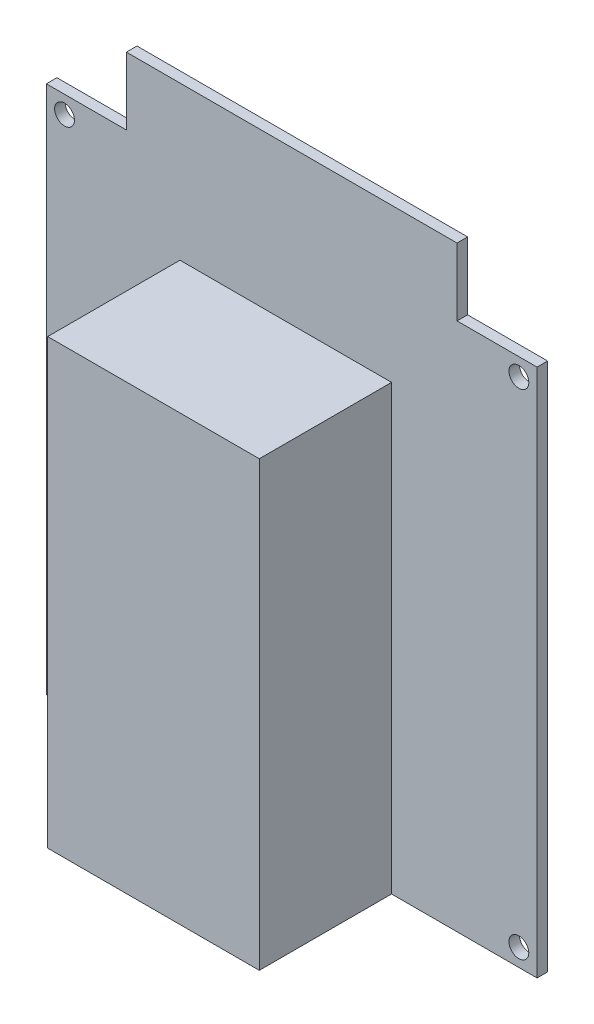
ISO-10303-21;
HEADER;
FILE_DESCRIPTION(('STEP AP214'),'2;1');
FILE_NAME('part.step','',(''),(''),'','','');
FILE_SCHEMA(('AUTOMOTIVE_DESIGN { 1 0 10303 214 1 1 1 1 }'));
ENDSEC;
DATA;
#1=APPLICATION_CONTEXT('core data for automotive mechanical design processes');
#2=APPLICATION_PROTOCOL_DEFINITION('international standard','automotive_design',2000,#1);
#3=PRODUCT_CONTEXT('',#1,'mechanical');
#4=PRODUCT('Part','Part','',(#3));
#5=PRODUCT_RELATED_PRODUCT_CATEGORY('part','',(#4));
#6=PRODUCT_DEFINITION_FORMATION('','',#4);
#7=PRODUCT_DEFINITION_CONTEXT('part definition',#1,'design');
#8=PRODUCT_DEFINITION('design','',#6,#7);
#9=PRODUCT_DEFINITION_SHAPE('','',#8);
#10=(LENGTH_UNIT() NAMED_UNIT(*) SI_UNIT(.MILLI.,.METRE.));
#11=(NAMED_UNIT(*) PLANE_ANGLE_UNIT() SI_UNIT($,.RADIAN.));
#12=(NAMED_UNIT(*) SI_UNIT($,.STERADIAN.) SOLID_ANGLE_UNIT());
#13=UNCERTAINTY_MEASURE_WITH_UNIT(LENGTH_MEASURE(1.E-05),#10,'distance_accuracy_value','');
#14=(GEOMETRIC_REPRESENTATION_CONTEXT(3) GLOBAL_UNCERTAINTY_ASSIGNED_CONTEXT((#13)) GLOBAL_UNIT_ASSIGNED_CONTEXT((#10,
#11,#12)) REPRESENTATION_CONTEXT('',''));
#15=CARTESIAN_POINT('',(0.,0.,0.));
#16=DIRECTION('',(0.,0.,1.));
#17=DIRECTION('',(1.,0.,0.));
#18=AXIS2_PLACEMENT_3D('',#15,#16,#17);
#19=CARTESIAN_POINT('',(20.2,67.,1.6));
#20=DIRECTION('',(0.,1.,0.));
#21=DIRECTION('',(0.,0.,1.));
#22=AXIS2_PLACEMENT_3D('',#19,#20,#21);
#23=PLANE('',#22);
#24=DIRECTION('',(1.,0.,0.));
#25=VECTOR('',#24,1.);
#26=CARTESIAN_POINT('',(37.1,67.,1.6));
#27=LINE('',#26,#25);
#28=CARTESIAN_POINT('',(20.2,67.,1.6));
#29=VERTEX_POINT('',#28);
#30=CARTESIAN_POINT('',(52.2,67.,1.6));
#31=VERTEX_POINT('',#30);
#32=EDGE_CURVE('E198',#29,#31,#27,.T.);
#33=ORIENTED_EDGE('',*,*,#32,.F.);
#34=DIRECTION('',(0.,0.,1.));
#35=VECTOR('',#34,1.);
#36=CARTESIAN_POINT('',(20.2,67.,1.6));
#37=LINE('',#36,#35);
#38=CARTESIAN_POINT('',(20.2,67.,21.6));
#39=VERTEX_POINT('',#38);
#40=EDGE_CURVE('E124',#39,#29,#37,.F.);
#41=ORIENTED_EDGE('',*,*,#40,.F.);
#42=DIRECTION('',(1.,0.,0.));
#43=VECTOR('',#42,1.);
#44=CARTESIAN_POINT('',(36.2,67.,21.6));
#45=LINE('',#44,#43);
#46=CARTESIAN_POINT('',(52.2,67.,21.6));
#47=VERTEX_POINT('',#46);
#48=EDGE_CURVE('E104',#47,#39,#45,.F.);
#49=ORIENTED_EDGE('',*,*,#48,.F.);
#50=DIRECTION('',(0.,0.,-1.));
#51=VECTOR('',#50,1.);
#52=CARTESIAN_POINT('',(52.2,67.,1.6));
#53=LINE('',#52,#51);
#54=EDGE_CURVE('E111',#31,#47,#53,.F.);
#55=ORIENTED_EDGE('',*,*,#54,.F.);
#56=EDGE_LOOP('',(#33,#41,#49,#55));
#57=FACE_BOUND('',#56,.T.);
#58=ADVANCED_FACE('F17',(#57),#23,.T.);
#59=CARTESIAN_POINT('',(52.2,67.,1.6));
#60=DIRECTION('',(1.,0.,0.));
#61=DIRECTION('',(0.,0.,-1.));
#62=AXIS2_PLACEMENT_3D('',#59,#60,#61);
#63=PLANE('',#62);
#64=DIRECTION('',(0.,1.,0.));
#65=VECTOR('',#64,1.);
#66=CARTESIAN_POINT('',(52.2,44.3492700729927,1.6));
#67=LINE('',#66,#65);
#68=CARTESIAN_POINT('',(52.2,0.,1.6));
#69=VERTEX_POINT('',#68);
#70=EDGE_CURVE('E116',#31,#69,#67,.F.);
#71=ORIENTED_EDGE('',*,*,#70,.F.);
#72=ORIENTED_EDGE('',*,*,#54,.T.);
#73=DIRECTION('',(0.,1.,0.));
#74=VECTOR('',#73,1.);
#75=CARTESIAN_POINT('',(52.2,33.5,21.6));
#76=LINE('',#75,#74);
#77=CARTESIAN_POINT('',(52.2,0.,21.6));
#78=VERTEX_POINT('',#77);
#79=EDGE_CURVE('E114',#78,#47,#76,.T.);
#80=ORIENTED_EDGE('',*,*,#79,.F.);
#81=DIRECTION('',(0.,0.,-1.));
#82=VECTOR('',#81,1.);
#83=CARTESIAN_POINT('',(52.2,0.,0.));
#84=LINE('',#83,#82);
#85=EDGE_CURVE('E167',#69,#78,#84,.F.);
#86=ORIENTED_EDGE('',*,*,#85,.F.);
#87=EDGE_LOOP('',(#71,#72,#80,#86));
#88=FACE_BOUND('',#87,.T.);
#89=ADVANCED_FACE('F112',(#88),#63,.T.);
#90=CARTESIAN_POINT('',(36.2,33.5,21.6));
#91=DIRECTION('',(0.,0.,1.));
#92=DIRECTION('',(1.,0.,0.));
#93=AXIS2_PLACEMENT_3D('',#90,#91,#92);
#94=PLANE('',#93);
#95=ORIENTED_EDGE('',*,*,#48,.T.);
#96=DIRECTION('',(0.,1.,0.));
#97=VECTOR('',#96,1.);
#98=CARTESIAN_POINT('',(20.2,0.,21.6));
#99=LINE('',#98,#97);
#100=CARTESIAN_POINT('',(20.2,0.,21.6));
#101=VERTEX_POINT('',#100);
#102=EDGE_CURVE('E125',#101,#39,#99,.T.);
#103=ORIENTED_EDGE('',*,*,#102,.F.);
#104=DIRECTION('',(1.,0.,0.));
#105=VECTOR('',#104,1.);
#106=CARTESIAN_POINT('',(74.2,0.,21.6));
#107=LINE('',#106,#105);
#108=EDGE_CURVE('E121',#78,#101,#107,.F.);
#109=ORIENTED_EDGE('',*,*,#108,.F.);
#110=ORIENTED_EDGE('',*,*,#79,.T.);
#111=EDGE_LOOP('',(#95,#103,#109,#110));
#112=FACE_BOUND('',#111,.T.);
#113=ADVANCED_FACE('F120',(#112),#94,.T.);
#114=CARTESIAN_POINT('',(20.2,0.,1.6));
#115=DIRECTION('',(-1.,0.,0.));
#116=DIRECTION('',(0.,0.,1.));
#117=AXIS2_PLACEMENT_3D('',#114,#115,#116);
#118=PLANE('',#117);
#119=DIRECTION('',(0.,1.,0.));
#120=VECTOR('',#119,1.);
#121=CARTESIAN_POINT('',(20.2,44.3492700729927,1.6));
#122=LINE('',#121,#120);
#123=CARTESIAN_POINT('',(20.2,0.,1.6));
#124=VERTEX_POINT('',#123);
#125=EDGE_CURVE('E200',#124,#29,#122,.T.);
#126=ORIENTED_EDGE('',*,*,#125,.F.);
#127=DIRECTION('',(0.,0.,-1.));
#128=VECTOR('',#127,1.);
#129=CARTESIAN_POINT('',(20.2,0.,0.));
#130=LINE('',#129,#128);
#131=EDGE_CURVE('E164',#101,#124,#130,.T.);
#132=ORIENTED_EDGE('',*,*,#131,.F.);
#133=ORIENTED_EDGE('',*,*,#102,.T.);
#134=ORIENTED_EDGE('',*,*,#40,.T.);
#135=EDGE_LOOP('',(#126,#132,#133,#134));
#136=FACE_BOUND('',#135,.T.);
#137=ADVANCED_FACE('F204',(#136),#118,.T.);
#138=CARTESIAN_POINT('',(37.1,44.3492700729927,1.6));
#139=DIRECTION('',(0.,0.,1.));
#140=DIRECTION('',(1.,0.,0.));
#141=AXIS2_PLACEMENT_3D('',#138,#139,#140);
#142=PLANE('',#141);
#143=CARTESIAN_POINT('',(71.45,2.65,1.6));
#144=DIRECTION('',(0.,0.,1.));
#145=DIRECTION('',(1.,0.,0.));
#146=AXIS2_PLACEMENT_3D('',#143,#144,#145);
#147=CIRCLE('',#146,1.5);
#148=CARTESIAN_POINT('',(72.95,2.65,1.6));
#149=VERTEX_POINT('',#148);
#150=EDGE_CURVE('E20',#149,#149,#147,.F.);
#151=ORIENTED_EDGE('',*,*,#150,.T.);
#152=EDGE_LOOP('',(#151));
#153=FACE_BOUND('',#152,.T.);
#154=CARTESIAN_POINT('',(2.75,2.65,1.6));
#155=DIRECTION('',(0.,0.,1.));
#156=DIRECTION('',(1.,0.,0.));
#157=AXIS2_PLACEMENT_3D('',#154,#155,#156);
#158=CIRCLE('',#157,1.5);
#159=CARTESIAN_POINT('',(4.25,2.65,1.6));
#160=VERTEX_POINT('',#159);
#161=EDGE_CURVE('E145',#160,#160,#158,.F.);
#162=ORIENTED_EDGE('',*,*,#161,.T.);
#163=EDGE_LOOP('',(#162));
#164=FACE_BOUND('',#163,.T.);
#165=CARTESIAN_POINT('',(71.45,77.35,1.6));
#166=DIRECTION('',(0.,0.,1.));
#167=DIRECTION('',(1.,0.,0.));
#168=AXIS2_PLACEMENT_3D('',#165,#166,#167);
#169=CIRCLE('',#168,1.5);
#170=CARTESIAN_POINT('',(72.95,77.35,1.6));
#171=VERTEX_POINT('',#170);
#172=EDGE_CURVE('E143',#171,#171,#169,.F.);
#173=ORIENTED_EDGE('',*,*,#172,.T.);
#174=EDGE_LOOP('',(#173));
#175=FACE_BOUND('',#174,.T.);
#176=CARTESIAN_POINT('',(2.75,77.35,1.6));
#177=DIRECTION('',(0.,0.,1.));
#178=DIRECTION('',(1.,0.,0.));
#179=AXIS2_PLACEMENT_3D('',#176,#177,#178);
#180=CIRCLE('',#179,1.5);
#181=CARTESIAN_POINT('',(4.25,77.35,1.6));
#182=VERTEX_POINT('',#181);
#183=EDGE_CURVE('E139',#182,#182,#180,.F.);
#184=ORIENTED_EDGE('',*,*,#183,.T.);
#185=EDGE_LOOP('',(#184));
#186=FACE_BOUND('',#185,.T.);
#187=DIRECTION('',(0.,1.,0.));
#188=VECTOR('',#187,1.);
#189=CARTESIAN_POINT('',(0.,0.,1.6));
#190=LINE('',#189,#188);
#191=CARTESIAN_POINT('',(0.,0.,1.6));
#192=VERTEX_POINT('',#191);
#193=CARTESIAN_POINT('',(0.,80.,1.6));
#194=VERTEX_POINT('',#193);
#195=EDGE_CURVE('E173',#192,#194,#190,.T.);
#196=ORIENTED_EDGE('',*,*,#195,.F.);
#197=DIRECTION('',(1.,0.,0.));
#198=VECTOR('',#197,1.);
#199=CARTESIAN_POINT('',(74.2,0.,1.6));
#200=LINE('',#199,#198);
#201=EDGE_CURVE('E158',#124,#192,#200,.F.);
#202=ORIENTED_EDGE('',*,*,#201,.F.);
#203=ORIENTED_EDGE('',*,*,#125,.T.);
#204=ORIENTED_EDGE('',*,*,#32,.T.);
#205=ORIENTED_EDGE('',*,*,#70,.T.);
#206=DIRECTION('',(1.,0.,0.));
#207=VECTOR('',#206,1.);
#208=CARTESIAN_POINT('',(74.2,0.,1.6));
#209=LINE('',#208,#207);
#210=CARTESIAN_POINT('',(74.2,0.,1.6));
#211=VERTEX_POINT('',#210);
#212=EDGE_CURVE('E169',#211,#69,#209,.F.);
#213=ORIENTED_EDGE('',*,*,#212,.F.);
#214=DIRECTION('',(0.,1.,0.));
#215=VECTOR('',#214,1.);
#216=CARTESIAN_POINT('',(74.2,80.,1.6));
#217=LINE('',#216,#215);
#218=CARTESIAN_POINT('',(74.2,80.,1.6));
#219=VERTEX_POINT('',#218);
#220=EDGE_CURVE('E195',#219,#211,#217,.F.);
#221=ORIENTED_EDGE('',*,*,#220,.F.);
#222=DIRECTION('',(1.,0.,0.));
#223=VECTOR('',#222,1.);
#224=CARTESIAN_POINT('',(62.1,80.,1.6));
#225=LINE('',#224,#223);
#226=CARTESIAN_POINT('',(62.1,80.,1.6));
#227=VERTEX_POINT('',#226);
#228=EDGE_CURVE('E193',#227,#219,#225,.T.);
#229=ORIENTED_EDGE('',*,*,#228,.F.);
#230=DIRECTION('',(0.,1.,0.));
#231=VECTOR('',#230,1.);
#232=CARTESIAN_POINT('',(62.1,90.2,1.6));
#233=LINE('',#232,#231);
#234=CARTESIAN_POINT('',(62.1,90.2,1.6));
#235=VERTEX_POINT('',#234);
#236=EDGE_CURVE('E189',#235,#227,#233,.F.);
#237=ORIENTED_EDGE('',*,*,#236,.F.);
#238=DIRECTION('',(1.,0.,0.));
#239=VECTOR('',#238,1.);
#240=CARTESIAN_POINT('',(12.1,90.2,1.6));
#241=LINE('',#240,#239);
#242=CARTESIAN_POINT('',(12.1,90.2,1.6));
#243=VERTEX_POINT('',#242);
#244=EDGE_CURVE('E185',#243,#235,#241,.T.);
#245=ORIENTED_EDGE('',*,*,#244,.F.);
#246=DIRECTION('',(0.,1.,0.));
#247=VECTOR('',#246,1.);
#248=CARTESIAN_POINT('',(12.1,80.,1.6));
#249=LINE('',#248,#247);
#250=CARTESIAN_POINT('',(12.1,80.,1.6));
#251=VERTEX_POINT('',#250);
#252=EDGE_CURVE('E181',#251,#243,#249,.T.);
#253=ORIENTED_EDGE('',*,*,#252,.F.);
#254=DIRECTION('',(1.,0.,0.));
#255=VECTOR('',#254,1.);
#256=CARTESIAN_POINT('',(0.,80.,1.6));
#257=LINE('',#256,#255);
#258=EDGE_CURVE('E177',#194,#251,#257,.T.);
#259=ORIENTED_EDGE('',*,*,#258,.F.);
#260=EDGE_LOOP('',(#196,#202,#203,#204,#205,#213,#221,#229,#237,#245,#253,#259));
#261=FACE_BOUND('',#260,.T.);
#262=ADVANCED_FACE('F209',(#153,#164,#175,#186,#261),#142,.T.);
#263=CARTESIAN_POINT('',(74.2,80.,0.));
#264=DIRECTION('',(1.,0.,0.));
#265=DIRECTION('',(0.,0.,-1.));
#266=AXIS2_PLACEMENT_3D('',#263,#264,#265);
#267=PLANE('',#266);
#268=DIRECTION('',(0.,1.,0.));
#269=VECTOR('',#268,1.);
#270=CARTESIAN_POINT('',(74.2,44.3492700729927,0.));
#271=LINE('',#270,#269);
#272=CARTESIAN_POINT('',(74.2,0.,0.));
#273=VERTEX_POINT('',#272);
#274=CARTESIAN_POINT('',(74.2,80.,0.));
#275=VERTEX_POINT('',#274);
#276=EDGE_CURVE('E142',#273,#275,#271,.T.);
#277=ORIENTED_EDGE('',*,*,#276,.T.);
#278=DIRECTION('',(0.,0.,1.));
#279=VECTOR('',#278,1.);
#280=CARTESIAN_POINT('',(74.2,80.,0.));
#281=LINE('',#280,#279);
#282=EDGE_CURVE('E191',#219,#275,#281,.F.);
#283=ORIENTED_EDGE('',*,*,#282,.F.);
#284=ORIENTED_EDGE('',*,*,#220,.T.);
#285=DIRECTION('',(0.,0.,-1.));
#286=VECTOR('',#285,1.);
#287=CARTESIAN_POINT('',(74.2,0.,0.));
#288=LINE('',#287,#286);
#289=EDGE_CURVE('E150',#273,#211,#288,.F.);
#290=ORIENTED_EDGE('',*,*,#289,.F.);
#291=EDGE_LOOP('',(#277,#283,#284,#290));
#292=FACE_BOUND('',#291,.T.);
#293=ADVANCED_FACE('F219',(#292),#267,.T.);
#294=CARTESIAN_POINT('',(62.1,80.,0.));
#295=DIRECTION('',(0.,1.,0.));
#296=DIRECTION('',(0.,0.,1.));
#297=AXIS2_PLACEMENT_3D('',#294,#295,#296);
#298=PLANE('',#297);
#299=DIRECTION('',(1.,0.,0.));
#300=VECTOR('',#299,1.);
#301=CARTESIAN_POINT('',(37.1,80.,0.));
#302=LINE('',#301,#300);
#303=CARTESIAN_POINT('',(62.1,80.,0.));
#304=VERTEX_POINT('',#303);
#305=EDGE_CURVE('E224',#275,#304,#302,.F.);
#306=ORIENTED_EDGE('',*,*,#305,.T.);
#307=DIRECTION('',(0.,0.,-1.));
#308=VECTOR('',#307,1.);
#309=CARTESIAN_POINT('',(62.1,80.,0.));
#310=LINE('',#309,#308);
#311=EDGE_CURVE('E187',#227,#304,#310,.T.);
#312=ORIENTED_EDGE('',*,*,#311,.F.);
#313=ORIENTED_EDGE('',*,*,#228,.T.);
#314=ORIENTED_EDGE('',*,*,#282,.T.);
#315=EDGE_LOOP('',(#306,#312,#313,#314));
#316=FACE_BOUND('',#315,.T.);
#317=ADVANCED_FACE('F223',(#316),#298,.T.);
#318=CARTESIAN_POINT('',(62.1,90.2,0.));
#319=DIRECTION('',(1.,0.,0.));
#320=DIRECTION('',(0.,0.,-1.));
#321=AXIS2_PLACEMENT_3D('',#318,#319,#320);
#322=PLANE('',#321);
#323=DIRECTION('',(0.,1.,0.));
#324=VECTOR('',#323,1.);
#325=CARTESIAN_POINT('',(62.1,44.3492700729927,0.));
#326=LINE('',#325,#324);
#327=CARTESIAN_POINT('',(62.1,90.2,0.));
#328=VERTEX_POINT('',#327);
#329=EDGE_CURVE('E231',#304,#328,#326,.T.);
#330=ORIENTED_EDGE('',*,*,#329,.T.);
#331=DIRECTION('',(0.,0.,1.));
#332=VECTOR('',#331,1.);
#333=CARTESIAN_POINT('',(62.1,90.2,0.));
#334=LINE('',#333,#332);
#335=EDGE_CURVE('E183',#235,#328,#334,.F.);
#336=ORIENTED_EDGE('',*,*,#335,.F.);
#337=ORIENTED_EDGE('',*,*,#236,.T.);
#338=ORIENTED_EDGE('',*,*,#311,.T.);
#339=EDGE_LOOP('',(#330,#336,#337,#338));
#340=FACE_BOUND('',#339,.T.);
#341=ADVANCED_FACE('F263',(#340),#322,.T.);
#342=CARTESIAN_POINT('',(12.1,90.2,0.));
#343=DIRECTION('',(0.,1.,0.));
#344=DIRECTION('',(0.,0.,1.));
#345=AXIS2_PLACEMENT_3D('',#342,#343,#344);
#346=PLANE('',#345);
#347=DIRECTION('',(1.,0.,0.));
#348=VECTOR('',#347,1.);
#349=CARTESIAN_POINT('',(37.1,90.2,0.));
#350=LINE('',#349,#348);
#351=CARTESIAN_POINT('',(12.1,90.2,0.));
#352=VERTEX_POINT('',#351);
#353=EDGE_CURVE('E232',#328,#352,#350,.F.);
#354=ORIENTED_EDGE('',*,*,#353,.T.);
#355=DIRECTION('',(0.,0.,1.));
#356=VECTOR('',#355,1.);
#357=CARTESIAN_POINT('',(12.1,90.2,0.));
#358=LINE('',#357,#356);
#359=EDGE_CURVE('E179',#243,#352,#358,.F.);
#360=ORIENTED_EDGE('',*,*,#359,.F.);
#361=ORIENTED_EDGE('',*,*,#244,.T.);
#362=ORIENTED_EDGE('',*,*,#335,.T.);
#363=EDGE_LOOP('',(#354,#360,#361,#362));
#364=FACE_BOUND('',#363,.T.);
#365=ADVANCED_FACE('F260',(#364),#346,.T.);
#366=CARTESIAN_POINT('',(12.1,80.,0.));
#367=DIRECTION('',(-1.,0.,0.));
#368=DIRECTION('',(0.,0.,1.));
#369=AXIS2_PLACEMENT_3D('',#366,#367,#368);
#370=PLANE('',#369);
#371=DIRECTION('',(0.,1.,0.));
#372=VECTOR('',#371,1.);
#373=CARTESIAN_POINT('',(12.1,44.3492700729927,0.));
#374=LINE('',#373,#372);
#375=CARTESIAN_POINT('',(12.1,80.,0.));
#376=VERTEX_POINT('',#375);
#377=EDGE_CURVE('E237',#352,#376,#374,.F.);
#378=ORIENTED_EDGE('',*,*,#377,.T.);
#379=DIRECTION('',(0.,0.,1.));
#380=VECTOR('',#379,1.);
#381=CARTESIAN_POINT('',(12.1,80.,0.));
#382=LINE('',#381,#380);
#383=EDGE_CURVE('E175',#251,#376,#382,.F.);
#384=ORIENTED_EDGE('',*,*,#383,.F.);
#385=ORIENTED_EDGE('',*,*,#252,.T.);
#386=ORIENTED_EDGE('',*,*,#359,.T.);
#387=EDGE_LOOP('',(#378,#384,#385,#386));
#388=FACE_BOUND('',#387,.T.);
#389=ADVANCED_FACE('F256',(#388),#370,.T.);
#390=CARTESIAN_POINT('',(0.,80.,0.));
#391=DIRECTION('',(0.,1.,0.));
#392=DIRECTION('',(0.,0.,1.));
#393=AXIS2_PLACEMENT_3D('',#390,#391,#392);
#394=PLANE('',#393);
#395=DIRECTION('',(1.,0.,0.));
#396=VECTOR('',#395,1.);
#397=CARTESIAN_POINT('',(37.1,80.,0.));
#398=LINE('',#397,#396);
#399=CARTESIAN_POINT('',(0.,80.,0.));
#400=VERTEX_POINT('',#399);
#401=EDGE_CURVE('E240',#376,#400,#398,.F.);
#402=ORIENTED_EDGE('',*,*,#401,.T.);
#403=DIRECTION('',(0.,0.,1.));
#404=VECTOR('',#403,1.);
#405=CARTESIAN_POINT('',(0.,80.,0.));
#406=LINE('',#405,#404);
#407=EDGE_CURVE('E171',#194,#400,#406,.F.);
#408=ORIENTED_EDGE('',*,*,#407,.F.);
#409=ORIENTED_EDGE('',*,*,#258,.T.);
#410=ORIENTED_EDGE('',*,*,#383,.T.);
#411=EDGE_LOOP('',(#402,#408,#409,#410));
#412=FACE_BOUND('',#411,.T.);
#413=ADVANCED_FACE('F251',(#412),#394,.T.);
#414=CARTESIAN_POINT('',(0.,0.,0.));
#415=DIRECTION('',(-1.,0.,0.));
#416=DIRECTION('',(0.,0.,1.));
#417=AXIS2_PLACEMENT_3D('',#414,#415,#416);
#418=PLANE('',#417);
#419=DIRECTION('',(0.,1.,0.));
#420=VECTOR('',#419,1.);
#421=CARTESIAN_POINT('',(0.,44.3492700729927,0.));
#422=LINE('',#421,#420);
#423=CARTESIAN_POINT('',(0.,0.,0.));
#424=VERTEX_POINT('',#423);
#425=EDGE_CURVE('E243',#400,#424,#422,.F.);
#426=ORIENTED_EDGE('',*,*,#425,.T.);
#427=DIRECTION('',(0.,0.,-1.));
#428=VECTOR('',#427,1.);
#429=CARTESIAN_POINT('',(0.,0.,0.));
#430=LINE('',#429,#428);
#431=EDGE_CURVE('E35',#192,#424,#430,.T.);
#432=ORIENTED_EDGE('',*,*,#431,.F.);
#433=ORIENTED_EDGE('',*,*,#195,.T.);
#434=ORIENTED_EDGE('',*,*,#407,.T.);
#435=EDGE_LOOP('',(#426,#432,#433,#434));
#436=FACE_BOUND('',#435,.T.);
#437=ADVANCED_FACE('F248',(#436),#418,.T.);
#438=CARTESIAN_POINT('',(74.2,0.,0.));
#439=DIRECTION('',(0.,-1.,0.));
#440=DIRECTION('',(0.,0.,-1.));
#441=AXIS2_PLACEMENT_3D('',#438,#439,#440);
#442=PLANE('',#441);
#443=DIRECTION('',(1.,0.,0.));
#444=VECTOR('',#443,1.);
#445=CARTESIAN_POINT('',(37.1,0.,0.));
#446=LINE('',#445,#444);
#447=EDGE_CURVE('E138',#424,#273,#446,.T.);
#448=ORIENTED_EDGE('',*,*,#447,.T.);
#449=ORIENTED_EDGE('',*,*,#289,.T.);
#450=ORIENTED_EDGE('',*,*,#212,.T.);
#451=ORIENTED_EDGE('',*,*,#85,.T.);
#452=ORIENTED_EDGE('',*,*,#108,.T.);
#453=ORIENTED_EDGE('',*,*,#131,.T.);
#454=ORIENTED_EDGE('',*,*,#201,.T.);
#455=ORIENTED_EDGE('',*,*,#431,.T.);
#456=EDGE_LOOP('',(#448,#449,#450,#451,#452,#453,#454,#455));
#457=FACE_BOUND('',#456,.T.);
#458=ADVANCED_FACE('F211',(#457),#442,.T.);
#459=CARTESIAN_POINT('',(71.45,2.65,0.));
#460=DIRECTION('',(0.,0.,1.));
#461=DIRECTION('',(1.,0.,0.));
#462=AXIS2_PLACEMENT_3D('',#459,#460,#461);
#463=CYLINDRICAL_SURFACE('',#462,1.5);
#464=CARTESIAN_POINT('',(71.45,2.65,0.));
#465=DIRECTION('',(0.,0.,1.));
#466=DIRECTION('',(1.,0.,0.));
#467=AXIS2_PLACEMENT_3D('',#464,#465,#466);
#468=CIRCLE('',#467,1.5);
#469=CARTESIAN_POINT('',(72.95,2.65,0.));
#470=VERTEX_POINT('',#469);
#471=EDGE_CURVE('E135',#470,#470,#468,.F.);
#472=ORIENTED_EDGE('',*,*,#471,.T.);
#473=EDGE_LOOP('',(#472));
#474=FACE_BOUND('',#473,.T.);
#475=ORIENTED_EDGE('',*,*,#150,.F.);
#476=EDGE_LOOP('',(#475));
#477=FACE_BOUND('',#476,.T.);
#478=ADVANCED_FACE('F292',(#474,#477),#463,.F.);
#479=CARTESIAN_POINT('',(2.75,2.65,0.));
#480=DIRECTION('',(0.,0.,1.));
#481=DIRECTION('',(1.,0.,0.));
#482=AXIS2_PLACEMENT_3D('',#479,#480,#481);
#483=CYLINDRICAL_SURFACE('',#482,1.5);
#484=CARTESIAN_POINT('',(2.75,2.65,0.));
#485=DIRECTION('',(0.,0.,1.));
#486=DIRECTION('',(1.,0.,0.));
#487=AXIS2_PLACEMENT_3D('',#484,#485,#486);
#488=CIRCLE('',#487,1.5);
#489=CARTESIAN_POINT('',(4.25,2.65,0.));
#490=VERTEX_POINT('',#489);
#491=EDGE_CURVE('E132',#490,#490,#488,.F.);
#492=ORIENTED_EDGE('',*,*,#491,.T.);
#493=EDGE_LOOP('',(#492));
#494=FACE_BOUND('',#493,.T.);
#495=ORIENTED_EDGE('',*,*,#161,.F.);
#496=EDGE_LOOP('',(#495));
#497=FACE_BOUND('',#496,.T.);
#498=ADVANCED_FACE('F288',(#494,#497),#483,.F.);
#499=CARTESIAN_POINT('',(71.45,77.35,0.));
#500=DIRECTION('',(0.,0.,1.));
#501=DIRECTION('',(1.,0.,0.));
#502=AXIS2_PLACEMENT_3D('',#499,#500,#501);
#503=CYLINDRICAL_SURFACE('',#502,1.5);
#504=CARTESIAN_POINT('',(71.45,77.35,0.));
#505=DIRECTION('',(0.,0.,1.));
#506=DIRECTION('',(1.,0.,0.));
#507=AXIS2_PLACEMENT_3D('',#504,#505,#506);
#508=CIRCLE('',#507,1.5);
#509=CARTESIAN_POINT('',(72.95,77.35,0.));
#510=VERTEX_POINT('',#509);
#511=EDGE_CURVE('E26',#510,#510,#508,.F.);
#512=ORIENTED_EDGE('',*,*,#511,.T.);
#513=EDGE_LOOP('',(#512));
#514=FACE_BOUND('',#513,.T.);
#515=ORIENTED_EDGE('',*,*,#172,.F.);
#516=EDGE_LOOP('',(#515));
#517=FACE_BOUND('',#516,.T.);
#518=ADVANCED_FACE('F280',(#514,#517),#503,.F.);
#519=CARTESIAN_POINT('',(2.75,77.35,0.));
#520=DIRECTION('',(0.,0.,1.));
#521=DIRECTION('',(1.,0.,0.));
#522=AXIS2_PLACEMENT_3D('',#519,#520,#521);
#523=CYLINDRICAL_SURFACE('',#522,1.5);
#524=CARTESIAN_POINT('',(2.75,77.35,0.));
#525=DIRECTION('',(0.,0.,1.));
#526=DIRECTION('',(1.,0.,0.));
#527=AXIS2_PLACEMENT_3D('',#524,#525,#526);
#528=CIRCLE('',#527,1.5);
#529=CARTESIAN_POINT('',(4.25,77.35,0.));
#530=VERTEX_POINT('',#529);
#531=EDGE_CURVE('E11',#530,#530,#528,.F.);
#532=ORIENTED_EDGE('',*,*,#531,.T.);
#533=EDGE_LOOP('',(#532));
#534=FACE_BOUND('',#533,.T.);
#535=ORIENTED_EDGE('',*,*,#183,.F.);
#536=EDGE_LOOP('',(#535));
#537=FACE_BOUND('',#536,.T.);
#538=ADVANCED_FACE('F274',(#534,#537),#523,.F.);
#539=CARTESIAN_POINT('',(37.1,44.3492700729927,0.));
#540=DIRECTION('',(0.,0.,1.));
#541=DIRECTION('',(1.,0.,0.));
#542=AXIS2_PLACEMENT_3D('',#539,#540,#541);
#543=PLANE('',#542);
#544=ORIENTED_EDGE('',*,*,#531,.F.);
#545=EDGE_LOOP('',(#544));
#546=FACE_BOUND('',#545,.T.);
#547=ORIENTED_EDGE('',*,*,#511,.F.);
#548=EDGE_LOOP('',(#547));
#549=FACE_BOUND('',#548,.T.);
#550=ORIENTED_EDGE('',*,*,#491,.F.);
#551=EDGE_LOOP('',(#550));
#552=FACE_BOUND('',#551,.T.);
#553=ORIENTED_EDGE('',*,*,#471,.F.);
#554=EDGE_LOOP('',(#553));
#555=FACE_BOUND('',#554,.T.);
#556=ORIENTED_EDGE('',*,*,#425,.F.);
#557=ORIENTED_EDGE('',*,*,#401,.F.);
#558=ORIENTED_EDGE('',*,*,#377,.F.);
#559=ORIENTED_EDGE('',*,*,#353,.F.);
#560=ORIENTED_EDGE('',*,*,#329,.F.);
#561=ORIENTED_EDGE('',*,*,#305,.F.);
#562=ORIENTED_EDGE('',*,*,#276,.F.);
#563=ORIENTED_EDGE('',*,*,#447,.F.);
#564=EDGE_LOOP('',(#556,#557,#558,#559,#560,#561,#562,#563));
#565=FACE_BOUND('',#564,.T.);
#566=ADVANCED_FACE('F228',(#546,#549,#552,#555,#565),#543,.F.);
#567=CLOSED_SHELL('',(#58,#89,#113,#137,#262,#293,#317,#341,#365,#389,#413,#437,#458,#478,#498,
#518,#538,#566));
#568=MANIFOLD_SOLID_BREP('B1',#567);
#569=ADVANCED_BREP_SHAPE_REPRESENTATION('',(#18,#568),#14);
#570=SHAPE_DEFINITION_REPRESENTATION(#9,#569);
ENDSEC;
END-ISO-10303-21;
